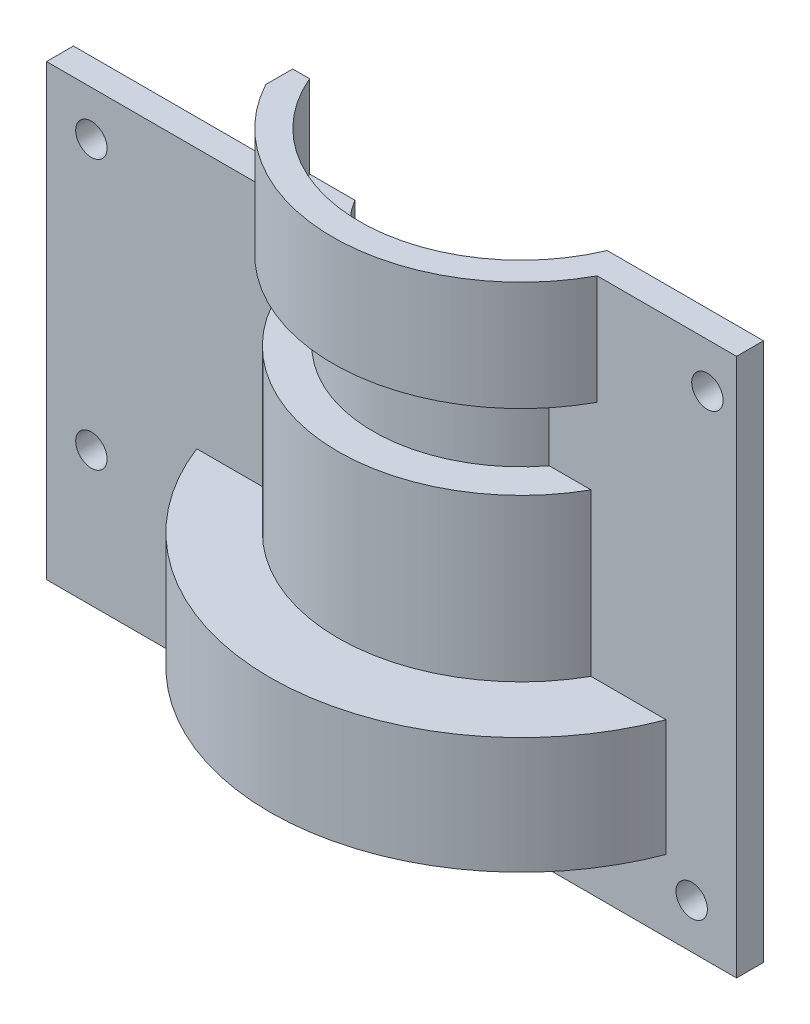
ISO-10303-21;
HEADER;
FILE_DESCRIPTION(('STEP AP214'),'2;1');
FILE_NAME('part.step','',(''),(''),'','','');
FILE_SCHEMA(('AUTOMOTIVE_DESIGN { 1 0 10303 214 1 1 1 1 }'));
ENDSEC;
DATA;
#1=APPLICATION_CONTEXT('core data for automotive mechanical design processes');
#2=APPLICATION_PROTOCOL_DEFINITION('international standard','automotive_design',2000,#1);
#3=PRODUCT_CONTEXT('',#1,'mechanical');
#4=PRODUCT('Part','Part','',(#3));
#5=PRODUCT_RELATED_PRODUCT_CATEGORY('part','',(#4));
#6=PRODUCT_DEFINITION_FORMATION('','',#4);
#7=PRODUCT_DEFINITION_CONTEXT('part definition',#1,'design');
#8=PRODUCT_DEFINITION('design','',#6,#7);
#9=PRODUCT_DEFINITION_SHAPE('','',#8);
#10=(LENGTH_UNIT() NAMED_UNIT(*) SI_UNIT(.MILLI.,.METRE.));
#11=(NAMED_UNIT(*) PLANE_ANGLE_UNIT() SI_UNIT($,.RADIAN.));
#12=(NAMED_UNIT(*) SI_UNIT($,.STERADIAN.) SOLID_ANGLE_UNIT());
#13=UNCERTAINTY_MEASURE_WITH_UNIT(LENGTH_MEASURE(1.E-05),#10,'distance_accuracy_value','');
#14=(GEOMETRIC_REPRESENTATION_CONTEXT(3) GLOBAL_UNCERTAINTY_ASSIGNED_CONTEXT((#13)) GLOBAL_UNIT_ASSIGNED_CONTEXT((#10,
#11,#12)) REPRESENTATION_CONTEXT('',''));
#15=CARTESIAN_POINT('',(0.,0.,0.));
#16=DIRECTION('',(0.,0.,1.));
#17=DIRECTION('',(1.,0.,0.));
#18=AXIS2_PLACEMENT_3D('',#15,#16,#17);
#19=CARTESIAN_POINT('',(38.45,30.,3.));
#20=DIRECTION('',(0.,-1.,0.));
#21=DIRECTION('',(1.,0.,0.));
#22=AXIS2_PLACEMENT_3D('',#19,#20,#21);
#23=PLANE('',#22);
#24=DIRECTION('',(-1.,0.,0.));
#25=VECTOR('',#24,1.);
#26=CARTESIAN_POINT('',(38.45,30.,0.));
#27=LINE('',#26,#25);
#28=CARTESIAN_POINT('',(-12.133123951777,30.,0.));
#29=VERTEX_POINT('',#28);
#30=CARTESIAN_POINT('',(-14.0161853126194,30.,0.));
#31=VERTEX_POINT('',#30);
#32=EDGE_CURVE('E213',#29,#31,#27,.T.);
#33=ORIENTED_EDGE('',*,*,#32,.T.);
#34=DIRECTION('',(0.,0.,1.));
#35=VECTOR('',#34,1.);
#36=CARTESIAN_POINT('',(-14.0161853126194,30.,0.));
#37=LINE('',#36,#35);
#38=CARTESIAN_POINT('',(-14.0161853126194,30.,3.));
#39=VERTEX_POINT('',#38);
#40=EDGE_CURVE('E333',#31,#39,#37,.T.);
#41=ORIENTED_EDGE('',*,*,#40,.T.);
#42=CARTESIAN_POINT('',(4.44999999999998,30.,-7.));
#43=DIRECTION('',(0.,-1.,0.));
#44=DIRECTION('',(1.,0.,0.));
#45=AXIS2_PLACEMENT_3D('',#42,#43,#44);
#46=CIRCLE('',#45,21.);
#47=CARTESIAN_POINT('',(22.9161853126194,30.,3.));
#48=VERTEX_POINT('',#47);
#49=EDGE_CURVE('E269',#39,#48,#46,.F.);
#50=ORIENTED_EDGE('',*,*,#49,.T.);
#51=DIRECTION('',(-1.,0.,0.));
#52=VECTOR('',#51,1.);
#53=CARTESIAN_POINT('',(38.45,30.,3.));
#54=LINE('',#53,#52);
#55=CARTESIAN_POINT('',(38.45,30.,3.));
#56=VERTEX_POINT('',#55);
#57=EDGE_CURVE('E209',#56,#48,#54,.T.);
#58=ORIENTED_EDGE('',*,*,#57,.F.);
#59=DIRECTION('',(0.,0.,-1.));
#60=VECTOR('',#59,1.);
#61=CARTESIAN_POINT('',(38.45,30.,3.));
#62=LINE('',#61,#60);
#63=CARTESIAN_POINT('',(38.45,30.,0.));
#64=VERTEX_POINT('',#63);
#65=EDGE_CURVE('E216',#56,#64,#62,.T.);
#66=ORIENTED_EDGE('',*,*,#65,.T.);
#67=CARTESIAN_POINT('',(21.033123951777,30.,0.));
#68=VERTEX_POINT('',#67);
#69=EDGE_CURVE('E214',#64,#68,#27,.T.);
#70=ORIENTED_EDGE('',*,*,#69,.T.);
#71=CARTESIAN_POINT('',(4.44999999999998,30.,-7.));
#72=DIRECTION('',(0.,1.,0.));
#73=DIRECTION('',(-1.,0.,0.));
#74=AXIS2_PLACEMENT_3D('',#71,#72,#73);
#75=CIRCLE('',#74,18.);
#76=EDGE_CURVE('E239',#29,#68,#75,.T.);
#77=ORIENTED_EDGE('',*,*,#76,.F.);
#78=EDGE_LOOP('',(#33,#41,#50,#58,#66,#70,#77));
#79=FACE_BOUND('',#78,.T.);
#80=ADVANCED_FACE('F36',(#79),#23,.F.);
#81=CARTESIAN_POINT('',(4.44999999999998,39.6639186464577,-7.));
#82=DIRECTION('',(0.,-1.,0.));
#83=DIRECTION('',(1.,0.,0.));
#84=AXIS2_PLACEMENT_3D('',#81,#82,#83);
#85=CYLINDRICAL_SURFACE('',#84,21.);
#86=ORIENTED_EDGE('',*,*,#49,.F.);
#87=DIRECTION('',(0.,-1.,0.));
#88=VECTOR('',#87,1.);
#89=CARTESIAN_POINT('',(-14.0161853126194,39.6639186464577,3.));
#90=LINE('',#89,#88);
#91=CARTESIAN_POINT('',(-14.0161853126194,20.,3.));
#92=VERTEX_POINT('',#91);
#93=EDGE_CURVE('E201',#39,#92,#90,.T.);
#94=ORIENTED_EDGE('',*,*,#93,.T.);
#95=CARTESIAN_POINT('',(-14.0161853126194,17.8,3.));
#96=VERTEX_POINT('',#95);
#97=EDGE_CURVE('E206',#92,#96,#90,.T.);
#98=ORIENTED_EDGE('',*,*,#97,.T.);
#99=CARTESIAN_POINT('',(4.44999999999998,17.8,-7.));
#100=DIRECTION('',(0.,-1.,0.));
#101=DIRECTION('',(1.,0.,0.));
#102=AXIS2_PLACEMENT_3D('',#99,#100,#101);
#103=CIRCLE('',#102,21.);
#104=CARTESIAN_POINT('',(22.9161853126194,17.8,3.));
#105=VERTEX_POINT('',#104);
#106=EDGE_CURVE('E271',#105,#96,#103,.T.);
#107=ORIENTED_EDGE('',*,*,#106,.F.);
#108=DIRECTION('',(0.,-1.,0.));
#109=VECTOR('',#108,1.);
#110=CARTESIAN_POINT('',(22.9161853126194,39.6639186464577,3.));
#111=LINE('',#110,#109);
#112=EDGE_CURVE('E315',#105,#48,#111,.F.);
#113=ORIENTED_EDGE('',*,*,#112,.T.);
#114=EDGE_LOOP('',(#86,#94,#98,#107,#113));
#115=FACE_BOUND('',#114,.T.);
#116=ADVANCED_FACE('F336',(#115),#85,.T.);
#117=CARTESIAN_POINT('',(-38.45,-30.,3.));
#118=DIRECTION('',(1.,0.,0.));
#119=DIRECTION('',(0.,0.,-1.));
#120=AXIS2_PLACEMENT_3D('',#117,#118,#119);
#121=PLANE('',#120);
#122=DIRECTION('',(0.,-1.,0.));
#123=VECTOR('',#122,1.);
#124=CARTESIAN_POINT('',(-38.45,-30.,3.));
#125=LINE('',#124,#123);
#126=CARTESIAN_POINT('',(-38.45,20.,3.));
#127=VERTEX_POINT('',#126);
#128=CARTESIAN_POINT('',(-38.45,-30.,3.));
#129=VERTEX_POINT('',#128);
#130=EDGE_CURVE('E195',#127,#129,#125,.T.);
#131=ORIENTED_EDGE('',*,*,#130,.F.);
#132=DIRECTION('',(0.,0.,1.));
#133=VECTOR('',#132,1.);
#134=CARTESIAN_POINT('',(-38.45,20.,0.));
#135=LINE('',#134,#133);
#136=CARTESIAN_POINT('',(-38.45,20.,0.));
#137=VERTEX_POINT('',#136);
#138=EDGE_CURVE('E184',#137,#127,#135,.T.);
#139=ORIENTED_EDGE('',*,*,#138,.F.);
#140=DIRECTION('',(0.,-1.,0.));
#141=VECTOR('',#140,1.);
#142=CARTESIAN_POINT('',(-38.45,-30.,0.));
#143=LINE('',#142,#141);
#144=CARTESIAN_POINT('',(-38.45,-30.,0.));
#145=VERTEX_POINT('',#144);
#146=EDGE_CURVE('E193',#137,#145,#143,.T.);
#147=ORIENTED_EDGE('',*,*,#146,.T.);
#148=DIRECTION('',(0.,0.,-1.));
#149=VECTOR('',#148,1.);
#150=CARTESIAN_POINT('',(-38.45,-30.,3.));
#151=LINE('',#150,#149);
#152=EDGE_CURVE('E221',#129,#145,#151,.T.);
#153=ORIENTED_EDGE('',*,*,#152,.F.);
#154=EDGE_LOOP('',(#131,#139,#147,#153));
#155=FACE_BOUND('',#154,.T.);
#156=ADVANCED_FACE('F38',(#155),#121,.F.);
#157=CARTESIAN_POINT('',(38.45,-30.,3.));
#158=DIRECTION('',(0.,1.,0.));
#159=DIRECTION('',(-1.,0.,0.));
#160=AXIS2_PLACEMENT_3D('',#157,#158,#159);
#161=PLANE('',#160);
#162=DIRECTION('',(1.,0.,0.));
#163=VECTOR('',#162,1.);
#164=CARTESIAN_POINT('',(38.45,-30.,0.));
#165=LINE('',#164,#163);
#166=CARTESIAN_POINT('',(38.45,-30.,0.));
#167=VERTEX_POINT('',#166);
#168=EDGE_CURVE('E199',#145,#167,#165,.T.);
#169=ORIENTED_EDGE('',*,*,#168,.T.);
#170=DIRECTION('',(0.,0.,-1.));
#171=VECTOR('',#170,1.);
#172=CARTESIAN_POINT('',(38.45,-30.,3.));
#173=LINE('',#172,#171);
#174=CARTESIAN_POINT('',(38.45,-30.,3.));
#175=VERTEX_POINT('',#174);
#176=EDGE_CURVE('E219',#175,#167,#173,.T.);
#177=ORIENTED_EDGE('',*,*,#176,.F.);
#178=DIRECTION('',(1.,0.,0.));
#179=VECTOR('',#178,1.);
#180=CARTESIAN_POINT('',(38.45,-30.,3.));
#181=LINE('',#180,#179);
#182=EDGE_CURVE('E319',#129,#175,#181,.T.);
#183=ORIENTED_EDGE('',*,*,#182,.F.);
#184=ORIENTED_EDGE('',*,*,#152,.T.);
#185=EDGE_LOOP('',(#169,#177,#183,#184));
#186=FACE_BOUND('',#185,.T.);
#187=ADVANCED_FACE('F389',(#186),#161,.F.);
#188=CARTESIAN_POINT('',(38.45,-30.,3.));
#189=DIRECTION('',(-1.,0.,0.));
#190=DIRECTION('',(0.,-1.,0.));
#191=AXIS2_PLACEMENT_3D('',#188,#189,#190);
#192=PLANE('',#191);
#193=DIRECTION('',(0.,1.,0.));
#194=VECTOR('',#193,1.);
#195=CARTESIAN_POINT('',(38.45,-30.,0.));
#196=LINE('',#195,#194);
#197=EDGE_CURVE('E203',#167,#64,#196,.T.);
#198=ORIENTED_EDGE('',*,*,#197,.T.);
#199=ORIENTED_EDGE('',*,*,#65,.F.);
#200=DIRECTION('',(0.,1.,0.));
#201=VECTOR('',#200,1.);
#202=CARTESIAN_POINT('',(38.45,-30.,3.));
#203=LINE('',#202,#201);
#204=EDGE_CURVE('E320',#175,#56,#203,.T.);
#205=ORIENTED_EDGE('',*,*,#204,.F.);
#206=ORIENTED_EDGE('',*,*,#176,.T.);
#207=EDGE_LOOP('',(#198,#199,#205,#206));
#208=FACE_BOUND('',#207,.T.);
#209=ADVANCED_FACE('F387',(#208),#192,.F.);
#210=CARTESIAN_POINT('',(0.,0.,3.));
#211=DIRECTION('',(0.,0.,1.));
#212=DIRECTION('',(1.,0.,0.));
#213=AXIS2_PLACEMENT_3D('',#210,#211,#212);
#214=PLANE('',#213);
#215=CARTESIAN_POINT('',(35.2,25.,3.));
#216=DIRECTION('',(0.,0.,1.));
#217=DIRECTION('',(1.,0.,0.));
#218=AXIS2_PLACEMENT_3D('',#215,#216,#217);
#219=CIRCLE('',#218,1.75);
#220=CARTESIAN_POINT('',(36.95,25.,3.));
#221=VERTEX_POINT('',#220);
#222=EDGE_CURVE('E623',#221,#221,#219,.T.);
#223=ORIENTED_EDGE('',*,*,#222,.F.);
#224=EDGE_LOOP('',(#223));
#225=FACE_BOUND('',#224,.T.);
#226=CARTESIAN_POINT('',(33.45,-25.,3.));
#227=DIRECTION('',(0.,0.,1.));
#228=DIRECTION('',(1.,0.,0.));
#229=AXIS2_PLACEMENT_3D('',#226,#227,#228);
#230=CIRCLE('',#229,1.75);
#231=CARTESIAN_POINT('',(35.2,-25.,3.));
#232=VERTEX_POINT('',#231);
#233=EDGE_CURVE('E625',#232,#232,#230,.T.);
#234=ORIENTED_EDGE('',*,*,#233,.F.);
#235=EDGE_LOOP('',(#234));
#236=FACE_BOUND('',#235,.T.);
#237=CARTESIAN_POINT('',(-33.45,-15.,3.));
#238=DIRECTION('',(0.,0.,1.));
#239=DIRECTION('',(1.,0.,0.));
#240=AXIS2_PLACEMENT_3D('',#237,#238,#239);
#241=CIRCLE('',#240,1.75);
#242=CARTESIAN_POINT('',(-31.7,-15.,3.));
#243=VERTEX_POINT('',#242);
#244=EDGE_CURVE('E636',#243,#243,#241,.T.);
#245=ORIENTED_EDGE('',*,*,#244,.F.);
#246=EDGE_LOOP('',(#245));
#247=FACE_BOUND('',#246,.T.);
#248=CARTESIAN_POINT('',(-33.45,15.,3.));
#249=DIRECTION('',(0.,0.,1.));
#250=DIRECTION('',(1.,0.,0.));
#251=AXIS2_PLACEMENT_3D('',#248,#249,#250);
#252=CIRCLE('',#251,1.75);
#253=CARTESIAN_POINT('',(-31.7,15.,3.));
#254=VERTEX_POINT('',#253);
#255=EDGE_CURVE('E630',#254,#254,#252,.T.);
#256=ORIENTED_EDGE('',*,*,#255,.F.);
#257=EDGE_LOOP('',(#256));
#258=FACE_BOUND('',#257,.T.);
#259=DIRECTION('',(1.,0.,0.));
#260=VECTOR('',#259,1.);
#261=CARTESIAN_POINT('',(-38.45,20.,3.));
#262=LINE('',#261,#260);
#263=EDGE_CURVE('E188',#127,#92,#262,.T.);
#264=ORIENTED_EDGE('',*,*,#263,.F.);
#265=ORIENTED_EDGE('',*,*,#130,.T.);
#266=ORIENTED_EDGE('',*,*,#182,.T.);
#267=ORIENTED_EDGE('',*,*,#204,.T.);
#268=ORIENTED_EDGE('',*,*,#57,.T.);
#269=ORIENTED_EDGE('',*,*,#112,.F.);
#270=DIRECTION('',(1.,0.,0.));
#271=VECTOR('',#270,1.);
#272=CARTESIAN_POINT('',(0.,17.8,3.));
#273=LINE('',#272,#271);
#274=CARTESIAN_POINT('',(17.5744047484067,17.8,3.));
#275=VERTEX_POINT('',#274);
#276=EDGE_CURVE('E292',#275,#105,#273,.T.);
#277=ORIENTED_EDGE('',*,*,#276,.F.);
#278=DIRECTION('',(0.,-1.,0.));
#279=VECTOR('',#278,1.);
#280=CARTESIAN_POINT('',(17.5744047484067,39.6639186464577,3.));
#281=LINE('',#280,#279);
#282=CARTESIAN_POINT('',(17.5744047484067,9.,2.99999999999999));
#283=VERTEX_POINT('',#282);
#284=EDGE_CURVE('E295',#283,#275,#281,.F.);
#285=ORIENTED_EDGE('',*,*,#284,.F.);
#286=DIRECTION('',(-1.,0.,0.));
#287=VECTOR('',#286,1.);
#288=CARTESIAN_POINT('',(0.,9.00000000000001,3.));
#289=LINE('',#288,#287);
#290=CARTESIAN_POINT('',(22.2308886167143,9.00000000000001,3.));
#291=VERTEX_POINT('',#290);
#292=EDGE_CURVE('E301',#291,#283,#289,.T.);
#293=ORIENTED_EDGE('',*,*,#292,.F.);
#294=DIRECTION('',(0.,-1.,0.));
#295=VECTOR('',#294,1.);
#296=CARTESIAN_POINT('',(22.2308886167143,39.6639186464577,3.));
#297=LINE('',#296,#295);
#298=CARTESIAN_POINT('',(22.2308886167143,-9.,3.));
#299=VERTEX_POINT('',#298);
#300=EDGE_CURVE('E302',#299,#291,#297,.F.);
#301=ORIENTED_EDGE('',*,*,#300,.F.);
#302=DIRECTION('',(-1.,0.,0.));
#303=VECTOR('',#302,1.);
#304=CARTESIAN_POINT('',(0.,-8.99999999999999,3.));
#305=LINE('',#304,#303);
#306=CARTESIAN_POINT('',(30.603393661244,-9.00000000000001,3.));
#307=VERTEX_POINT('',#306);
#308=EDGE_CURVE('E308',#307,#299,#305,.T.);
#309=ORIENTED_EDGE('',*,*,#308,.F.);
#310=DIRECTION('',(0.,-1.,0.));
#311=VECTOR('',#310,1.);
#312=CARTESIAN_POINT('',(30.603393661244,39.6639186464577,3.));
#313=LINE('',#312,#311);
#314=CARTESIAN_POINT('',(30.603393661244,-22.,3.));
#315=VERTEX_POINT('',#314);
#316=EDGE_CURVE('E309',#315,#307,#313,.F.);
#317=ORIENTED_EDGE('',*,*,#316,.F.);
#318=DIRECTION('',(1.,0.,0.));
#319=VECTOR('',#318,1.);
#320=CARTESIAN_POINT('',(0.,-22.,3.));
#321=LINE('',#320,#319);
#322=CARTESIAN_POINT('',(-21.7033936612441,-22.,3.));
#323=VERTEX_POINT('',#322);
#324=EDGE_CURVE('E313',#323,#315,#321,.T.);
#325=ORIENTED_EDGE('',*,*,#324,.F.);
#326=DIRECTION('',(0.,-1.,0.));
#327=VECTOR('',#326,1.);
#328=CARTESIAN_POINT('',(-21.7033936612441,39.6639186464577,3.));
#329=LINE('',#328,#327);
#330=CARTESIAN_POINT('',(-21.7033936612441,-9.,3.));
#331=VERTEX_POINT('',#330);
#332=EDGE_CURVE('E311',#331,#323,#329,.T.);
#333=ORIENTED_EDGE('',*,*,#332,.F.);
#334=CARTESIAN_POINT('',(-13.3308886167143,-8.99999999999999,3.));
#335=VERTEX_POINT('',#334);
#336=EDGE_CURVE('E306',#335,#331,#305,.T.);
#337=ORIENTED_EDGE('',*,*,#336,.F.);
#338=DIRECTION('',(0.,-1.,0.));
#339=VECTOR('',#338,1.);
#340=CARTESIAN_POINT('',(-13.3308886167143,39.6639186464577,3.));
#341=LINE('',#340,#339);
#342=CARTESIAN_POINT('',(-13.3308886167143,9.00000000000001,3.));
#343=VERTEX_POINT('',#342);
#344=EDGE_CURVE('E304',#343,#335,#341,.T.);
#345=ORIENTED_EDGE('',*,*,#344,.F.);
#346=CARTESIAN_POINT('',(-8.6744047484067,9.00000000000001,3.));
#347=VERTEX_POINT('',#346);
#348=EDGE_CURVE('E299',#347,#343,#289,.T.);
#349=ORIENTED_EDGE('',*,*,#348,.F.);
#350=DIRECTION('',(0.,-1.,0.));
#351=VECTOR('',#350,1.);
#352=CARTESIAN_POINT('',(-8.6744047484067,39.6639186464577,3.));
#353=LINE('',#352,#351);
#354=CARTESIAN_POINT('',(-8.67440474840671,17.8,3.));
#355=VERTEX_POINT('',#354);
#356=EDGE_CURVE('E297',#355,#347,#353,.T.);
#357=ORIENTED_EDGE('',*,*,#356,.F.);
#358=EDGE_CURVE('E294',#96,#355,#273,.T.);
#359=ORIENTED_EDGE('',*,*,#358,.F.);
#360=ORIENTED_EDGE('',*,*,#97,.F.);
#361=EDGE_LOOP('',(#264,#265,#266,#267,#268,#269,#277,#285,#293,#301,#309,#317,#325,#333,#337,
#345,#349,#357,#359,#360));
#362=FACE_BOUND('',#361,.T.);
#363=ADVANCED_FACE('F327',(#225,#236,#247,#258,#362),#214,.T.);
#364=CARTESIAN_POINT('',(0.,0.,0.));
#365=DIRECTION('',(0.,0.,1.));
#366=DIRECTION('',(1.,0.,0.));
#367=AXIS2_PLACEMENT_3D('',#364,#365,#366);
#368=PLANE('',#367);
#369=CARTESIAN_POINT('',(35.2,25.,0.));
#370=DIRECTION('',(0.,0.,1.));
#371=DIRECTION('',(1.,0.,0.));
#372=AXIS2_PLACEMENT_3D('',#369,#370,#371);
#373=CIRCLE('',#372,1.75);
#374=CARTESIAN_POINT('',(36.95,25.,0.));
#375=VERTEX_POINT('',#374);
#376=EDGE_CURVE('E620',#375,#375,#373,.T.);
#377=ORIENTED_EDGE('',*,*,#376,.T.);
#378=EDGE_LOOP('',(#377));
#379=FACE_BOUND('',#378,.T.);
#380=CARTESIAN_POINT('',(33.45,-25.,0.));
#381=DIRECTION('',(0.,0.,1.));
#382=DIRECTION('',(1.,0.,0.));
#383=AXIS2_PLACEMENT_3D('',#380,#381,#382);
#384=CIRCLE('',#383,1.75);
#385=CARTESIAN_POINT('',(35.2,-25.,0.));
#386=VERTEX_POINT('',#385);
#387=EDGE_CURVE('E641',#386,#386,#384,.T.);
#388=ORIENTED_EDGE('',*,*,#387,.T.);
#389=EDGE_LOOP('',(#388));
#390=FACE_BOUND('',#389,.T.);
#391=CARTESIAN_POINT('',(-33.45,-15.,0.));
#392=DIRECTION('',(0.,0.,1.));
#393=DIRECTION('',(1.,0.,0.));
#394=AXIS2_PLACEMENT_3D('',#391,#392,#393);
#395=CIRCLE('',#394,1.75);
#396=CARTESIAN_POINT('',(-31.7,-15.,0.));
#397=VERTEX_POINT('',#396);
#398=EDGE_CURVE('E632',#397,#397,#395,.T.);
#399=ORIENTED_EDGE('',*,*,#398,.T.);
#400=EDGE_LOOP('',(#399));
#401=FACE_BOUND('',#400,.T.);
#402=CARTESIAN_POINT('',(-33.45,15.,0.));
#403=DIRECTION('',(0.,0.,1.));
#404=DIRECTION('',(1.,0.,0.));
#405=AXIS2_PLACEMENT_3D('',#402,#403,#404);
#406=CIRCLE('',#405,1.75);
#407=CARTESIAN_POINT('',(-31.7,15.,0.));
#408=VERTEX_POINT('',#407);
#409=EDGE_CURVE('E400',#408,#408,#406,.T.);
#410=ORIENTED_EDGE('',*,*,#409,.T.);
#411=EDGE_LOOP('',(#410));
#412=FACE_BOUND('',#411,.T.);
#413=DIRECTION('',(1.,0.,0.));
#414=VECTOR('',#413,1.);
#415=CARTESIAN_POINT('',(-38.45,20.,0.));
#416=LINE('',#415,#414);
#417=CARTESIAN_POINT('',(-14.0161853126194,20.,0.));
#418=VERTEX_POINT('',#417);
#419=EDGE_CURVE('E180',#137,#418,#416,.T.);
#420=ORIENTED_EDGE('',*,*,#419,.T.);
#421=DIRECTION('',(0.,1.,0.));
#422=VECTOR('',#421,1.);
#423=CARTESIAN_POINT('',(-14.0161853126194,30.,0.));
#424=LINE('',#423,#422);
#425=EDGE_CURVE('E51',#418,#31,#424,.T.);
#426=ORIENTED_EDGE('',*,*,#425,.T.);
#427=ORIENTED_EDGE('',*,*,#32,.F.);
#428=DIRECTION('',(0.,1.,0.));
#429=VECTOR('',#428,1.);
#430=CARTESIAN_POINT('',(-12.133123951777,30.,0.));
#431=LINE('',#430,#429);
#432=CARTESIAN_POINT('',(-12.133123951777,20.8,0.));
#433=VERTEX_POINT('',#432);
#434=EDGE_CURVE('E246',#29,#433,#431,.F.);
#435=ORIENTED_EDGE('',*,*,#434,.T.);
#436=DIRECTION('',(1.,0.,0.));
#437=VECTOR('',#436,1.);
#438=CARTESIAN_POINT('',(0.,20.8,0.));
#439=LINE('',#438,#437);
#440=CARTESIAN_POINT('',(-7.09339638061522,20.8,0.));
#441=VERTEX_POINT('',#440);
#442=EDGE_CURVE('E11',#433,#441,#439,.T.);
#443=ORIENTED_EDGE('',*,*,#442,.T.);
#444=DIRECTION('',(0.,1.,0.));
#445=VECTOR('',#444,1.);
#446=CARTESIAN_POINT('',(-7.09339638061522,30.,0.));
#447=LINE('',#446,#445);
#448=CARTESIAN_POINT('',(-7.09339638061522,6.00000000000001,0.));
#449=VERTEX_POINT('',#448);
#450=EDGE_CURVE('E250',#441,#449,#447,.F.);
#451=ORIENTED_EDGE('',*,*,#450,.T.);
#452=DIRECTION('',(-1.,0.,0.));
#453=VECTOR('',#452,1.);
#454=CARTESIAN_POINT('',(0.,6.00000000000001,0.));
#455=LINE('',#454,#453);
#456=CARTESIAN_POINT('',(-11.4798462013919,6.00000000000001,0.));
#457=VERTEX_POINT('',#456);
#458=EDGE_CURVE('E407',#449,#457,#455,.T.);
#459=ORIENTED_EDGE('',*,*,#458,.T.);
#460=DIRECTION('',(0.,1.,0.));
#461=VECTOR('',#460,1.);
#462=CARTESIAN_POINT('',(-11.4798462013919,30.,0.));
#463=LINE('',#462,#461);
#464=CARTESIAN_POINT('',(-11.4798462013919,-12.,0.));
#465=VERTEX_POINT('',#464);
#466=EDGE_CURVE('E416',#457,#465,#463,.F.);
#467=ORIENTED_EDGE('',*,*,#466,.T.);
#468=DIRECTION('',(-1.,0.,0.));
#469=VECTOR('',#468,1.);
#470=CARTESIAN_POINT('',(0.,-12.,0.));
#471=LINE('',#470,#469);
#472=CARTESIAN_POINT('',(-19.55,-12.,0.));
#473=VERTEX_POINT('',#472);
#474=EDGE_CURVE('E412',#465,#473,#471,.T.);
#475=ORIENTED_EDGE('',*,*,#474,.T.);
#476=DIRECTION('',(0.,1.,0.));
#477=VECTOR('',#476,1.);
#478=CARTESIAN_POINT('',(-19.55,30.,0.));
#479=LINE('',#478,#477);
#480=CARTESIAN_POINT('',(-19.55,-19.,0.));
#481=VERTEX_POINT('',#480);
#482=EDGE_CURVE('E240',#473,#481,#479,.F.);
#483=ORIENTED_EDGE('',*,*,#482,.T.);
#484=DIRECTION('',(1.,0.,0.));
#485=VECTOR('',#484,1.);
#486=CARTESIAN_POINT('',(0.,-19.,0.));
#487=LINE('',#486,#485);
#488=CARTESIAN_POINT('',(28.45,-19.,0.));
#489=VERTEX_POINT('',#488);
#490=EDGE_CURVE('E241',#481,#489,#487,.T.);
#491=ORIENTED_EDGE('',*,*,#490,.T.);
#492=DIRECTION('',(0.,1.,0.));
#493=VECTOR('',#492,1.);
#494=CARTESIAN_POINT('',(28.45,30.,0.));
#495=LINE('',#494,#493);
#496=CARTESIAN_POINT('',(28.45,-12.,0.));
#497=VERTEX_POINT('',#496);
#498=EDGE_CURVE('E411',#489,#497,#495,.T.);
#499=ORIENTED_EDGE('',*,*,#498,.T.);
#500=CARTESIAN_POINT('',(20.3798462013919,-12.,0.));
#501=VERTEX_POINT('',#500);
#502=EDGE_CURVE('E409',#497,#501,#471,.T.);
#503=ORIENTED_EDGE('',*,*,#502,.T.);
#504=DIRECTION('',(0.,1.,0.));
#505=VECTOR('',#504,1.);
#506=CARTESIAN_POINT('',(20.3798462013919,30.,0.));
#507=LINE('',#506,#505);
#508=CARTESIAN_POINT('',(20.3798462013919,6.,0.));
#509=VERTEX_POINT('',#508);
#510=EDGE_CURVE('E406',#501,#509,#507,.T.);
#511=ORIENTED_EDGE('',*,*,#510,.T.);
#512=CARTESIAN_POINT('',(15.9933963806152,6.00000000000001,0.));
#513=VERTEX_POINT('',#512);
#514=EDGE_CURVE('E404',#509,#513,#455,.T.);
#515=ORIENTED_EDGE('',*,*,#514,.T.);
#516=DIRECTION('',(0.,1.,0.));
#517=VECTOR('',#516,1.);
#518=CARTESIAN_POINT('',(15.9933963806152,30.,0.));
#519=LINE('',#518,#517);
#520=CARTESIAN_POINT('',(15.9933963806152,20.8,0.));
#521=VERTEX_POINT('',#520);
#522=EDGE_CURVE('E59',#513,#521,#519,.T.);
#523=ORIENTED_EDGE('',*,*,#522,.T.);
#524=CARTESIAN_POINT('',(21.033123951777,20.8,0.));
#525=VERTEX_POINT('',#524);
#526=EDGE_CURVE('E40',#521,#525,#439,.T.);
#527=ORIENTED_EDGE('',*,*,#526,.T.);
#528=DIRECTION('',(0.,1.,0.));
#529=VECTOR('',#528,1.);
#530=CARTESIAN_POINT('',(21.033123951777,30.,0.));
#531=LINE('',#530,#529);
#532=EDGE_CURVE('E227',#525,#68,#531,.T.);
#533=ORIENTED_EDGE('',*,*,#532,.T.);
#534=ORIENTED_EDGE('',*,*,#69,.F.);
#535=ORIENTED_EDGE('',*,*,#197,.F.);
#536=ORIENTED_EDGE('',*,*,#168,.F.);
#537=ORIENTED_EDGE('',*,*,#146,.F.);
#538=EDGE_LOOP('',(#420,#426,#427,#435,#443,#451,#459,#467,#475,#483,#491,#499,#503,#511,#515,
#523,#527,#533,#534,#535,#536,#537));
#539=FACE_BOUND('',#538,.T.);
#540=ADVANCED_FACE('F197',(#379,#390,#401,#412,#539),#368,.F.);
#541=CARTESIAN_POINT('',(8.89999999999995,-22.,-7.00000000000003));
#542=DIRECTION('',(0.,-1.,0.));
#543=DIRECTION('',(1.,0.,0.));
#544=AXIS2_PLACEMENT_3D('',#541,#542,#543);
#545=PLANE('',#544);
#546=CARTESIAN_POINT('',(4.44999999999997,-22.,-7.));
#547=DIRECTION('',(0.,-1.,0.));
#548=DIRECTION('',(1.,0.,0.));
#549=AXIS2_PLACEMENT_3D('',#546,#547,#548);
#550=CIRCLE('',#549,28.);
#551=EDGE_CURVE('E289',#315,#323,#550,.T.);
#552=ORIENTED_EDGE('',*,*,#551,.T.);
#553=ORIENTED_EDGE('',*,*,#324,.T.);
#554=EDGE_LOOP('',(#552,#553));
#555=FACE_BOUND('',#554,.T.);
#556=ADVANCED_FACE('F369',(#555),#545,.T.);
#557=CARTESIAN_POINT('',(4.44999999999998,39.6639186464577,-7.));
#558=DIRECTION('',(0.,-1.,0.));
#559=DIRECTION('',(1.,0.,0.));
#560=AXIS2_PLACEMENT_3D('',#557,#558,#559);
#561=CYLINDRICAL_SURFACE('',#560,28.);
#562=CARTESIAN_POINT('',(4.44999999999998,-9.,-7.));
#563=DIRECTION('',(0.,-1.,0.));
#564=DIRECTION('',(1.,0.,0.));
#565=AXIS2_PLACEMENT_3D('',#562,#563,#564);
#566=CIRCLE('',#565,28.);
#567=EDGE_CURVE('E286',#307,#331,#566,.T.);
#568=ORIENTED_EDGE('',*,*,#567,.T.);
#569=ORIENTED_EDGE('',*,*,#332,.T.);
#570=ORIENTED_EDGE('',*,*,#551,.F.);
#571=ORIENTED_EDGE('',*,*,#316,.T.);
#572=EDGE_LOOP('',(#568,#569,#570,#571));
#573=FACE_BOUND('',#572,.T.);
#574=ADVANCED_FACE('F367',(#573),#561,.T.);
#575=CARTESIAN_POINT('',(8.89999999999995,-9.,-7.00000000000003));
#576=DIRECTION('',(0.,1.,0.));
#577=DIRECTION('',(-1.,0.,0.));
#578=AXIS2_PLACEMENT_3D('',#575,#576,#577);
#579=PLANE('',#578);
#580=ORIENTED_EDGE('',*,*,#567,.F.);
#581=ORIENTED_EDGE('',*,*,#308,.T.);
#582=CARTESIAN_POINT('',(4.44999999999998,-8.99999999999999,-7.));
#583=DIRECTION('',(0.,-1.,0.));
#584=DIRECTION('',(1.,0.,0.));
#585=AXIS2_PLACEMENT_3D('',#582,#583,#584);
#586=CIRCLE('',#585,20.4);
#587=EDGE_CURVE('E283',#299,#335,#586,.T.);
#588=ORIENTED_EDGE('',*,*,#587,.T.);
#589=ORIENTED_EDGE('',*,*,#336,.T.);
#590=EDGE_LOOP('',(#580,#581,#588,#589));
#591=FACE_BOUND('',#590,.T.);
#592=ADVANCED_FACE('F362',(#591),#579,.T.);
#593=CARTESIAN_POINT('',(4.44999999999998,39.6639186464577,-7.));
#594=DIRECTION('',(0.,-1.,0.));
#595=DIRECTION('',(1.,0.,0.));
#596=AXIS2_PLACEMENT_3D('',#593,#594,#595);
#597=CYLINDRICAL_SURFACE('',#596,20.4);
#598=CARTESIAN_POINT('',(4.44999999999998,9.00000000000001,-7.));
#599=DIRECTION('',(0.,-1.,0.));
#600=DIRECTION('',(1.,0.,0.));
#601=AXIS2_PLACEMENT_3D('',#598,#599,#600);
#602=CIRCLE('',#601,20.4);
#603=EDGE_CURVE('E280',#291,#343,#602,.T.);
#604=ORIENTED_EDGE('',*,*,#603,.T.);
#605=ORIENTED_EDGE('',*,*,#344,.T.);
#606=ORIENTED_EDGE('',*,*,#587,.F.);
#607=ORIENTED_EDGE('',*,*,#300,.T.);
#608=EDGE_LOOP('',(#604,#605,#606,#607));
#609=FACE_BOUND('',#608,.T.);
#610=ADVANCED_FACE('F358',(#609),#597,.T.);
#611=CARTESIAN_POINT('',(8.89999999999995,9.00000000000001,-7.00000000000003));
#612=DIRECTION('',(0.,1.,0.));
#613=DIRECTION('',(-1.,0.,0.));
#614=AXIS2_PLACEMENT_3D('',#611,#612,#613);
#615=PLANE('',#614);
#616=ORIENTED_EDGE('',*,*,#603,.F.);
#617=ORIENTED_EDGE('',*,*,#292,.T.);
#618=CARTESIAN_POINT('',(4.44999999999998,9.00000000000001,-7.));
#619=DIRECTION('',(0.,-1.,0.));
#620=DIRECTION('',(1.,0.,0.));
#621=AXIS2_PLACEMENT_3D('',#618,#619,#620);
#622=CIRCLE('',#621,16.5);
#623=EDGE_CURVE('E277',#283,#347,#622,.T.);
#624=ORIENTED_EDGE('',*,*,#623,.T.);
#625=ORIENTED_EDGE('',*,*,#348,.T.);
#626=EDGE_LOOP('',(#616,#617,#624,#625));
#627=FACE_BOUND('',#626,.T.);
#628=ADVANCED_FACE('F351',(#627),#615,.T.);
#629=CARTESIAN_POINT('',(4.44999999999998,39.6639186464577,-7.));
#630=DIRECTION('',(0.,-1.,0.));
#631=DIRECTION('',(1.,0.,0.));
#632=AXIS2_PLACEMENT_3D('',#629,#630,#631);
#633=CYLINDRICAL_SURFACE('',#632,16.5);
#634=CARTESIAN_POINT('',(4.44999999999998,17.8,-7.));
#635=DIRECTION('',(0.,-1.,0.));
#636=DIRECTION('',(1.,0.,0.));
#637=AXIS2_PLACEMENT_3D('',#634,#635,#636);
#638=CIRCLE('',#637,16.5);
#639=EDGE_CURVE('E274',#275,#355,#638,.T.);
#640=ORIENTED_EDGE('',*,*,#639,.T.);
#641=ORIENTED_EDGE('',*,*,#356,.T.);
#642=ORIENTED_EDGE('',*,*,#623,.F.);
#643=ORIENTED_EDGE('',*,*,#284,.T.);
#644=EDGE_LOOP('',(#640,#641,#642,#643));
#645=FACE_BOUND('',#644,.T.);
#646=ADVANCED_FACE('F347',(#645),#633,.T.);
#647=CARTESIAN_POINT('',(8.89999999999996,17.8,-7.00000000000003));
#648=DIRECTION('',(0.,-1.,0.));
#649=DIRECTION('',(1.,0.,0.));
#650=AXIS2_PLACEMENT_3D('',#647,#648,#649);
#651=PLANE('',#650);
#652=ORIENTED_EDGE('',*,*,#106,.T.);
#653=ORIENTED_EDGE('',*,*,#358,.T.);
#654=ORIENTED_EDGE('',*,*,#639,.F.);
#655=ORIENTED_EDGE('',*,*,#276,.T.);
#656=EDGE_LOOP('',(#652,#653,#654,#655));
#657=FACE_BOUND('',#656,.T.);
#658=ADVANCED_FACE('F340',(#657),#651,.T.);
#659=CARTESIAN_POINT('',(4.44999999999998,30.,-7.));
#660=DIRECTION('',(0.,1.,0.));
#661=DIRECTION('',(-1.,0.,0.));
#662=AXIS2_PLACEMENT_3D('',#659,#660,#661);
#663=CYLINDRICAL_SURFACE('',#662,18.);
#664=ORIENTED_EDGE('',*,*,#532,.F.);
#665=CARTESIAN_POINT('',(4.44999999999998,20.8,-7.));
#666=DIRECTION('',(0.,1.,0.));
#667=DIRECTION('',(-1.,0.,0.));
#668=AXIS2_PLACEMENT_3D('',#665,#666,#667);
#669=CIRCLE('',#668,18.);
#670=EDGE_CURVE('E237',#433,#525,#669,.T.);
#671=ORIENTED_EDGE('',*,*,#670,.F.);
#672=ORIENTED_EDGE('',*,*,#434,.F.);
#673=ORIENTED_EDGE('',*,*,#76,.T.);
#674=EDGE_LOOP('',(#664,#671,#672,#673));
#675=FACE_BOUND('',#674,.T.);
#676=ADVANCED_FACE('F235',(#675),#663,.F.);
#677=CARTESIAN_POINT('',(0.,-19.,-7.));
#678=DIRECTION('',(0.,1.,0.));
#679=DIRECTION('',(-1.,0.,0.));
#680=AXIS2_PLACEMENT_3D('',#677,#678,#679);
#681=PLANE('',#680);
#682=ORIENTED_EDGE('',*,*,#490,.F.);
#683=CARTESIAN_POINT('',(4.44999999999997,-19.,-7.));
#684=DIRECTION('',(0.,1.,0.));
#685=DIRECTION('',(-1.,0.,0.));
#686=AXIS2_PLACEMENT_3D('',#683,#684,#685);
#687=CIRCLE('',#686,25.);
#688=EDGE_CURVE('E265',#481,#489,#687,.T.);
#689=ORIENTED_EDGE('',*,*,#688,.T.);
#690=EDGE_LOOP('',(#682,#689));
#691=FACE_BOUND('',#690,.T.);
#692=ADVANCED_FACE('F452',(#691),#681,.T.);
#693=CARTESIAN_POINT('',(4.44999999999998,30.,-7.));
#694=DIRECTION('',(0.,1.,0.));
#695=DIRECTION('',(-1.,0.,0.));
#696=AXIS2_PLACEMENT_3D('',#693,#694,#695);
#697=CYLINDRICAL_SURFACE('',#696,25.);
#698=ORIENTED_EDGE('',*,*,#498,.F.);
#699=ORIENTED_EDGE('',*,*,#688,.F.);
#700=ORIENTED_EDGE('',*,*,#482,.F.);
#701=CARTESIAN_POINT('',(4.44999999999998,-12.,-7.));
#702=DIRECTION('',(0.,1.,0.));
#703=DIRECTION('',(-1.,0.,0.));
#704=AXIS2_PLACEMENT_3D('',#701,#702,#703);
#705=CIRCLE('',#704,25.);
#706=EDGE_CURVE('E262',#473,#497,#705,.T.);
#707=ORIENTED_EDGE('',*,*,#706,.T.);
#708=EDGE_LOOP('',(#698,#699,#700,#707));
#709=FACE_BOUND('',#708,.T.);
#710=ADVANCED_FACE('F448',(#709),#697,.F.);
#711=CARTESIAN_POINT('',(0.,-12.,-7.));
#712=DIRECTION('',(0.,-1.,0.));
#713=DIRECTION('',(1.,0.,0.));
#714=AXIS2_PLACEMENT_3D('',#711,#712,#713);
#715=PLANE('',#714);
#716=ORIENTED_EDGE('',*,*,#502,.F.);
#717=ORIENTED_EDGE('',*,*,#706,.F.);
#718=ORIENTED_EDGE('',*,*,#474,.F.);
#719=CARTESIAN_POINT('',(4.44999999999998,-12.,-7.));
#720=DIRECTION('',(0.,1.,0.));
#721=DIRECTION('',(-1.,0.,0.));
#722=AXIS2_PLACEMENT_3D('',#719,#720,#721);
#723=CIRCLE('',#722,17.4);
#724=EDGE_CURVE('E259',#465,#501,#723,.T.);
#725=ORIENTED_EDGE('',*,*,#724,.T.);
#726=EDGE_LOOP('',(#716,#717,#718,#725));
#727=FACE_BOUND('',#726,.T.);
#728=ADVANCED_FACE('F445',(#727),#715,.T.);
#729=CARTESIAN_POINT('',(4.44999999999998,30.,-7.));
#730=DIRECTION('',(0.,1.,0.));
#731=DIRECTION('',(-1.,0.,0.));
#732=AXIS2_PLACEMENT_3D('',#729,#730,#731);
#733=CYLINDRICAL_SURFACE('',#732,17.4);
#734=ORIENTED_EDGE('',*,*,#510,.F.);
#735=ORIENTED_EDGE('',*,*,#724,.F.);
#736=ORIENTED_EDGE('',*,*,#466,.F.);
#737=CARTESIAN_POINT('',(4.44999999999998,6.00000000000001,-7.));
#738=DIRECTION('',(0.,1.,0.));
#739=DIRECTION('',(-1.,0.,0.));
#740=AXIS2_PLACEMENT_3D('',#737,#738,#739);
#741=CIRCLE('',#740,17.4);
#742=EDGE_CURVE('E256',#457,#509,#741,.T.);
#743=ORIENTED_EDGE('',*,*,#742,.T.);
#744=EDGE_LOOP('',(#734,#735,#736,#743));
#745=FACE_BOUND('',#744,.T.);
#746=ADVANCED_FACE('F427',(#745),#733,.F.);
#747=CARTESIAN_POINT('',(0.,6.00000000000001,-7.));
#748=DIRECTION('',(0.,-1.,0.));
#749=DIRECTION('',(1.,0.,0.));
#750=AXIS2_PLACEMENT_3D('',#747,#748,#749);
#751=PLANE('',#750);
#752=ORIENTED_EDGE('',*,*,#514,.F.);
#753=ORIENTED_EDGE('',*,*,#742,.F.);
#754=ORIENTED_EDGE('',*,*,#458,.F.);
#755=CARTESIAN_POINT('',(4.44999999999998,6.00000000000001,-7.));
#756=DIRECTION('',(0.,1.,0.));
#757=DIRECTION('',(-1.,0.,0.));
#758=AXIS2_PLACEMENT_3D('',#755,#756,#757);
#759=CIRCLE('',#758,13.5);
#760=EDGE_CURVE('E248',#449,#513,#759,.T.);
#761=ORIENTED_EDGE('',*,*,#760,.T.);
#762=EDGE_LOOP('',(#752,#753,#754,#761));
#763=FACE_BOUND('',#762,.T.);
#764=ADVANCED_FACE('F429',(#763),#751,.T.);
#765=CARTESIAN_POINT('',(4.44999999999998,30.,-7.));
#766=DIRECTION('',(0.,1.,0.));
#767=DIRECTION('',(-1.,0.,0.));
#768=AXIS2_PLACEMENT_3D('',#765,#766,#767);
#769=CYLINDRICAL_SURFACE('',#768,13.5);
#770=ORIENTED_EDGE('',*,*,#522,.F.);
#771=ORIENTED_EDGE('',*,*,#760,.F.);
#772=ORIENTED_EDGE('',*,*,#450,.F.);
#773=CARTESIAN_POINT('',(4.44999999999998,20.8,-7.));
#774=DIRECTION('',(0.,1.,0.));
#775=DIRECTION('',(-1.,0.,0.));
#776=AXIS2_PLACEMENT_3D('',#773,#774,#775);
#777=CIRCLE('',#776,13.5);
#778=EDGE_CURVE('E245',#441,#521,#777,.T.);
#779=ORIENTED_EDGE('',*,*,#778,.T.);
#780=EDGE_LOOP('',(#770,#771,#772,#779));
#781=FACE_BOUND('',#780,.T.);
#782=ADVANCED_FACE('F431',(#781),#769,.F.);
#783=CARTESIAN_POINT('',(0.,20.8,-7.));
#784=DIRECTION('',(0.,1.,0.));
#785=DIRECTION('',(-1.,0.,0.));
#786=AXIS2_PLACEMENT_3D('',#783,#784,#785);
#787=PLANE('',#786);
#788=ORIENTED_EDGE('',*,*,#442,.F.);
#789=ORIENTED_EDGE('',*,*,#670,.T.);
#790=ORIENTED_EDGE('',*,*,#526,.F.);
#791=ORIENTED_EDGE('',*,*,#778,.F.);
#792=EDGE_LOOP('',(#788,#789,#790,#791));
#793=FACE_BOUND('',#792,.T.);
#794=ADVANCED_FACE('F244',(#793),#787,.T.);
#795=CARTESIAN_POINT('',(-14.0161853126194,30.,0.));
#796=DIRECTION('',(1.,0.,0.));
#797=DIRECTION('',(0.,0.,-1.));
#798=AXIS2_PLACEMENT_3D('',#795,#796,#797);
#799=PLANE('',#798);
#800=ORIENTED_EDGE('',*,*,#93,.F.);
#801=ORIENTED_EDGE('',*,*,#40,.F.);
#802=ORIENTED_EDGE('',*,*,#425,.F.);
#803=DIRECTION('',(0.,0.,1.));
#804=VECTOR('',#803,1.);
#805=CARTESIAN_POINT('',(-14.0161853126194,20.,0.));
#806=LINE('',#805,#804);
#807=EDGE_CURVE('E186',#418,#92,#806,.T.);
#808=ORIENTED_EDGE('',*,*,#807,.T.);
#809=EDGE_LOOP('',(#800,#801,#802,#808));
#810=FACE_BOUND('',#809,.T.);
#811=ADVANCED_FACE('F438',(#810),#799,.F.);
#812=CARTESIAN_POINT('',(-38.45,20.,0.));
#813=DIRECTION('',(0.,-1.,0.));
#814=DIRECTION('',(0.,0.,-1.));
#815=AXIS2_PLACEMENT_3D('',#812,#813,#814);
#816=PLANE('',#815);
#817=ORIENTED_EDGE('',*,*,#263,.T.);
#818=ORIENTED_EDGE('',*,*,#807,.F.);
#819=ORIENTED_EDGE('',*,*,#419,.F.);
#820=ORIENTED_EDGE('',*,*,#138,.T.);
#821=EDGE_LOOP('',(#817,#818,#819,#820));
#822=FACE_BOUND('',#821,.T.);
#823=ADVANCED_FACE('F183',(#822),#816,.F.);
#824=CARTESIAN_POINT('',(-33.45,15.,0.));
#825=DIRECTION('',(0.,0.,1.));
#826=DIRECTION('',(1.,0.,0.));
#827=AXIS2_PLACEMENT_3D('',#824,#825,#826);
#828=CYLINDRICAL_SURFACE('',#827,1.75);
#829=ORIENTED_EDGE('',*,*,#409,.F.);
#830=EDGE_LOOP('',(#829));
#831=FACE_BOUND('',#830,.T.);
#832=ORIENTED_EDGE('',*,*,#255,.T.);
#833=EDGE_LOOP('',(#832));
#834=FACE_BOUND('',#833,.T.);
#835=ADVANCED_FACE('F560',(#831,#834),#828,.F.);
#836=CARTESIAN_POINT('',(-33.45,-15.,0.));
#837=DIRECTION('',(0.,0.,1.));
#838=DIRECTION('',(1.,0.,0.));
#839=AXIS2_PLACEMENT_3D('',#836,#837,#838);
#840=CYLINDRICAL_SURFACE('',#839,1.75);
#841=ORIENTED_EDGE('',*,*,#398,.F.);
#842=EDGE_LOOP('',(#841));
#843=FACE_BOUND('',#842,.T.);
#844=ORIENTED_EDGE('',*,*,#244,.T.);
#845=EDGE_LOOP('',(#844));
#846=FACE_BOUND('',#845,.T.);
#847=ADVANCED_FACE('F583',(#843,#846),#840,.F.);
#848=CARTESIAN_POINT('',(33.45,-25.,0.));
#849=DIRECTION('',(0.,0.,1.));
#850=DIRECTION('',(1.,0.,0.));
#851=AXIS2_PLACEMENT_3D('',#848,#849,#850);
#852=CYLINDRICAL_SURFACE('',#851,1.75);
#853=ORIENTED_EDGE('',*,*,#387,.F.);
#854=EDGE_LOOP('',(#853));
#855=FACE_BOUND('',#854,.T.);
#856=ORIENTED_EDGE('',*,*,#233,.T.);
#857=EDGE_LOOP('',(#856));
#858=FACE_BOUND('',#857,.T.);
#859=ADVANCED_FACE('F593',(#855,#858),#852,.F.);
#860=CARTESIAN_POINT('',(35.2,25.,0.));
#861=DIRECTION('',(0.,0.,1.));
#862=DIRECTION('',(1.,0.,0.));
#863=AXIS2_PLACEMENT_3D('',#860,#861,#862);
#864=CYLINDRICAL_SURFACE('',#863,1.75);
#865=ORIENTED_EDGE('',*,*,#376,.F.);
#866=EDGE_LOOP('',(#865));
#867=FACE_BOUND('',#866,.T.);
#868=ORIENTED_EDGE('',*,*,#222,.T.);
#869=EDGE_LOOP('',(#868));
#870=FACE_BOUND('',#869,.T.);
#871=ADVANCED_FACE('F603',(#867,#870),#864,.F.);
#872=CLOSED_SHELL('',(#80,#116,#156,#187,#209,#363,#540,#556,#574,#592,#610,#628,#646,#658,#676,
#692,#710,#728,#746,#764,#782,#794,#811,#823,#835,#847,#859,#871));
#873=MANIFOLD_SOLID_BREP('B2',#872);
#874=ADVANCED_BREP_SHAPE_REPRESENTATION('',(#18,#873),#14);
#875=SHAPE_DEFINITION_REPRESENTATION(#9,#874);
ENDSEC;
END-ISO-10303-21;
